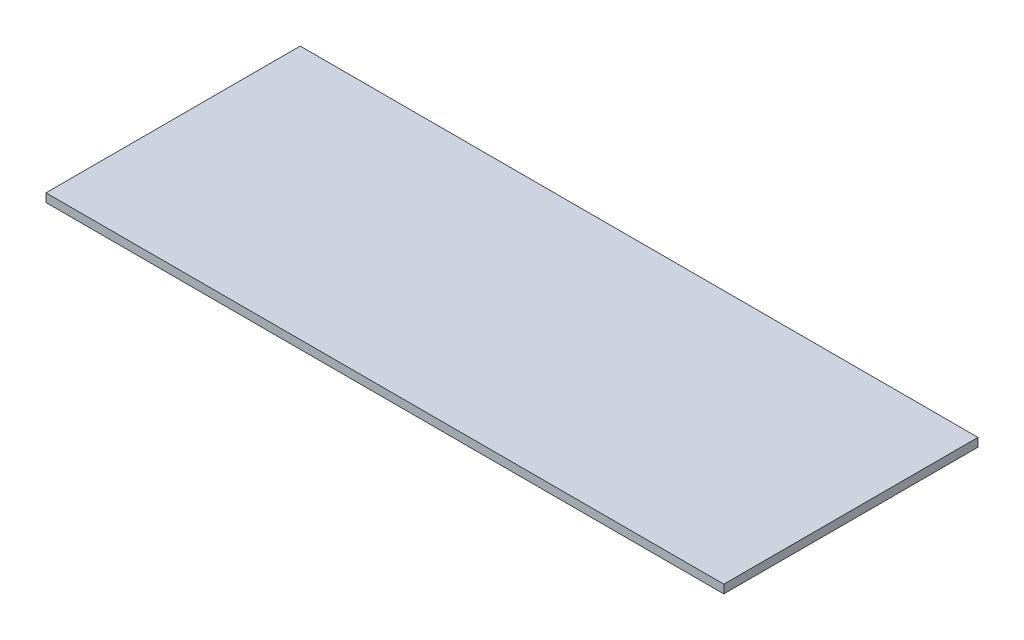
ISO-10303-21;
HEADER;
FILE_DESCRIPTION(('STEP AP214'),'2;1');
FILE_NAME('part.step','',(''),(''),'','','');
FILE_SCHEMA(('AUTOMOTIVE_DESIGN { 1 0 10303 214 1 1 1 1 }'));
ENDSEC;
DATA;
#1=APPLICATION_CONTEXT('core data for automotive mechanical design processes');
#2=APPLICATION_PROTOCOL_DEFINITION('international standard','automotive_design',2000,#1);
#3=PRODUCT_CONTEXT('',#1,'mechanical');
#4=PRODUCT('Part','Part','',(#3));
#5=PRODUCT_RELATED_PRODUCT_CATEGORY('part','',(#4));
#6=PRODUCT_DEFINITION_FORMATION('','',#4);
#7=PRODUCT_DEFINITION_CONTEXT('part definition',#1,'design');
#8=PRODUCT_DEFINITION('design','',#6,#7);
#9=PRODUCT_DEFINITION_SHAPE('','',#8);
#10=(LENGTH_UNIT() NAMED_UNIT(*) SI_UNIT(.MILLI.,.METRE.));
#11=(NAMED_UNIT(*) PLANE_ANGLE_UNIT() SI_UNIT($,.RADIAN.));
#12=(NAMED_UNIT(*) SI_UNIT($,.STERADIAN.) SOLID_ANGLE_UNIT());
#13=UNCERTAINTY_MEASURE_WITH_UNIT(LENGTH_MEASURE(1.E-05),#10,'distance_accuracy_value','');
#14=(GEOMETRIC_REPRESENTATION_CONTEXT(3) GLOBAL_UNCERTAINTY_ASSIGNED_CONTEXT((#13)) GLOBAL_UNIT_ASSIGNED_CONTEXT((#10,
#11,#12)) REPRESENTATION_CONTEXT('',''));
#15=CARTESIAN_POINT('',(0.,0.,0.));
#16=DIRECTION('',(0.,0.,1.));
#17=DIRECTION('',(1.,0.,0.));
#18=AXIS2_PLACEMENT_3D('',#15,#16,#17);
#19=CARTESIAN_POINT('',(0.,2.54,0.));
#20=DIRECTION('',(1.,0.,0.));
#21=DIRECTION('',(0.,0.,-1.));
#22=AXIS2_PLACEMENT_3D('',#19,#20,#21);
#23=PLANE('',#22);
#24=DIRECTION('',(0.,0.,1.));
#25=VECTOR('',#24,1.);
#26=CARTESIAN_POINT('',(0.,0.,0.));
#27=LINE('',#26,#25);
#28=CARTESIAN_POINT('',(0.,0.,0.));
#29=VERTEX_POINT('',#28);
#30=CARTESIAN_POINT('',(0.,0.,76.2));
#31=VERTEX_POINT('',#30);
#32=EDGE_CURVE('E96',#29,#31,#27,.T.);
#33=ORIENTED_EDGE('',*,*,#32,.T.);
#34=DIRECTION('',(0.,-1.,0.));
#35=VECTOR('',#34,1.);
#36=CARTESIAN_POINT('',(0.,2.54,76.2));
#37=LINE('',#36,#35);
#38=CARTESIAN_POINT('',(0.,2.54,76.2));
#39=VERTEX_POINT('',#38);
#40=EDGE_CURVE('E11',#39,#31,#37,.T.);
#41=ORIENTED_EDGE('',*,*,#40,.F.);
#42=DIRECTION('',(0.,0.,1.));
#43=VECTOR('',#42,1.);
#44=CARTESIAN_POINT('',(0.,2.54,0.));
#45=LINE('',#44,#43);
#46=CARTESIAN_POINT('',(0.,2.54,0.));
#47=VERTEX_POINT('',#46);
#48=EDGE_CURVE('E84',#47,#39,#45,.T.);
#49=ORIENTED_EDGE('',*,*,#48,.F.);
#50=DIRECTION('',(0.,-1.,0.));
#51=VECTOR('',#50,1.);
#52=CARTESIAN_POINT('',(0.,2.54,0.));
#53=LINE('',#52,#51);
#54=EDGE_CURVE('E92',#47,#29,#53,.T.);
#55=ORIENTED_EDGE('',*,*,#54,.T.);
#56=EDGE_LOOP('',(#33,#41,#49,#55));
#57=FACE_BOUND('',#56,.T.);
#58=ADVANCED_FACE('F33',(#57),#23,.F.);
#59=CARTESIAN_POINT('',(0.,2.54,76.2));
#60=DIRECTION('',(0.,0.,-1.));
#61=DIRECTION('',(-1.,0.,0.));
#62=AXIS2_PLACEMENT_3D('',#59,#60,#61);
#63=PLANE('',#62);
#64=DIRECTION('',(1.,0.,0.));
#65=VECTOR('',#64,1.);
#66=CARTESIAN_POINT('',(0.,0.,76.2));
#67=LINE('',#66,#65);
#68=CARTESIAN_POINT('',(203.2,0.,76.2));
#69=VERTEX_POINT('',#68);
#70=EDGE_CURVE('E88',#31,#69,#67,.T.);
#71=ORIENTED_EDGE('',*,*,#70,.T.);
#72=DIRECTION('',(0.,-1.,0.));
#73=VECTOR('',#72,1.);
#74=CARTESIAN_POINT('',(203.2,2.54,76.2));
#75=LINE('',#74,#73);
#76=CARTESIAN_POINT('',(203.2,2.54,76.2));
#77=VERTEX_POINT('',#76);
#78=EDGE_CURVE('E41',#77,#69,#75,.T.);
#79=ORIENTED_EDGE('',*,*,#78,.F.);
#80=DIRECTION('',(1.,0.,0.));
#81=VECTOR('',#80,1.);
#82=CARTESIAN_POINT('',(0.,2.54,76.2));
#83=LINE('',#82,#81);
#84=EDGE_CURVE('E79',#39,#77,#83,.T.);
#85=ORIENTED_EDGE('',*,*,#84,.F.);
#86=ORIENTED_EDGE('',*,*,#40,.T.);
#87=EDGE_LOOP('',(#71,#79,#85,#86));
#88=FACE_BOUND('',#87,.T.);
#89=ADVANCED_FACE('F87',(#88),#63,.F.);
#90=CARTESIAN_POINT('',(203.2,2.54,0.));
#91=DIRECTION('',(-1.,0.,0.));
#92=DIRECTION('',(0.,0.,1.));
#93=AXIS2_PLACEMENT_3D('',#90,#91,#92);
#94=PLANE('',#93);
#95=DIRECTION('',(0.,0.,-1.));
#96=VECTOR('',#95,1.);
#97=CARTESIAN_POINT('',(203.2,0.,0.));
#98=LINE('',#97,#96);
#99=CARTESIAN_POINT('',(203.2,0.,0.));
#100=VERTEX_POINT('',#99);
#101=EDGE_CURVE('E66',#69,#100,#98,.T.);
#102=ORIENTED_EDGE('',*,*,#101,.T.);
#103=DIRECTION('',(0.,-1.,0.));
#104=VECTOR('',#103,1.);
#105=CARTESIAN_POINT('',(203.2,2.54,0.));
#106=LINE('',#105,#104);
#107=CARTESIAN_POINT('',(203.2,2.54,0.));
#108=VERTEX_POINT('',#107);
#109=EDGE_CURVE('E89',#108,#100,#106,.T.);
#110=ORIENTED_EDGE('',*,*,#109,.F.);
#111=DIRECTION('',(0.,0.,-1.));
#112=VECTOR('',#111,1.);
#113=CARTESIAN_POINT('',(203.2,2.54,0.));
#114=LINE('',#113,#112);
#115=EDGE_CURVE('E82',#77,#108,#114,.T.);
#116=ORIENTED_EDGE('',*,*,#115,.F.);
#117=ORIENTED_EDGE('',*,*,#78,.T.);
#118=EDGE_LOOP('',(#102,#110,#116,#117));
#119=FACE_BOUND('',#118,.T.);
#120=ADVANCED_FACE('F90',(#119),#94,.F.);
#121=CARTESIAN_POINT('',(0.,2.54,0.));
#122=DIRECTION('',(0.,0.,1.));
#123=DIRECTION('',(1.,0.,0.));
#124=AXIS2_PLACEMENT_3D('',#121,#122,#123);
#125=PLANE('',#124);
#126=DIRECTION('',(-1.,0.,0.));
#127=VECTOR('',#126,1.);
#128=CARTESIAN_POINT('',(0.,0.,0.));
#129=LINE('',#128,#127);
#130=EDGE_CURVE('E72',#100,#29,#129,.T.);
#131=ORIENTED_EDGE('',*,*,#130,.T.);
#132=ORIENTED_EDGE('',*,*,#54,.F.);
#133=DIRECTION('',(-1.,0.,0.));
#134=VECTOR('',#133,1.);
#135=CARTESIAN_POINT('',(0.,2.54,0.));
#136=LINE('',#135,#134);
#137=EDGE_CURVE('E49',#108,#47,#136,.T.);
#138=ORIENTED_EDGE('',*,*,#137,.F.);
#139=ORIENTED_EDGE('',*,*,#109,.T.);
#140=EDGE_LOOP('',(#131,#132,#138,#139));
#141=FACE_BOUND('',#140,.T.);
#142=ADVANCED_FACE('F103',(#141),#125,.F.);
#143=CARTESIAN_POINT('',(0.,2.54,0.));
#144=DIRECTION('',(0.,1.,0.));
#145=DIRECTION('',(0.,0.,1.));
#146=AXIS2_PLACEMENT_3D('',#143,#144,#145);
#147=PLANE('',#146);
#148=ORIENTED_EDGE('',*,*,#48,.T.);
#149=ORIENTED_EDGE('',*,*,#84,.T.);
#150=ORIENTED_EDGE('',*,*,#115,.T.);
#151=ORIENTED_EDGE('',*,*,#137,.T.);
#152=EDGE_LOOP('',(#148,#149,#150,#151));
#153=FACE_BOUND('',#152,.T.);
#154=ADVANCED_FACE('F80',(#153),#147,.T.);
#155=CARTESIAN_POINT('',(0.,0.,0.));
#156=DIRECTION('',(0.,1.,0.));
#157=DIRECTION('',(0.,0.,1.));
#158=AXIS2_PLACEMENT_3D('',#155,#156,#157);
#159=PLANE('',#158);
#160=ORIENTED_EDGE('',*,*,#32,.F.);
#161=ORIENTED_EDGE('',*,*,#130,.F.);
#162=ORIENTED_EDGE('',*,*,#101,.F.);
#163=ORIENTED_EDGE('',*,*,#70,.F.);
#164=EDGE_LOOP('',(#160,#161,#162,#163));
#165=FACE_BOUND('',#164,.T.);
#166=ADVANCED_FACE('F106',(#165),#159,.F.);
#167=CLOSED_SHELL('',(#58,#89,#120,#142,#154,#166));
#168=MANIFOLD_SOLID_BREP('B2',#167);
#169=ADVANCED_BREP_SHAPE_REPRESENTATION('',(#18,#168),#14);
#170=SHAPE_DEFINITION_REPRESENTATION(#9,#169);
ENDSEC;
END-ISO-10303-21;
